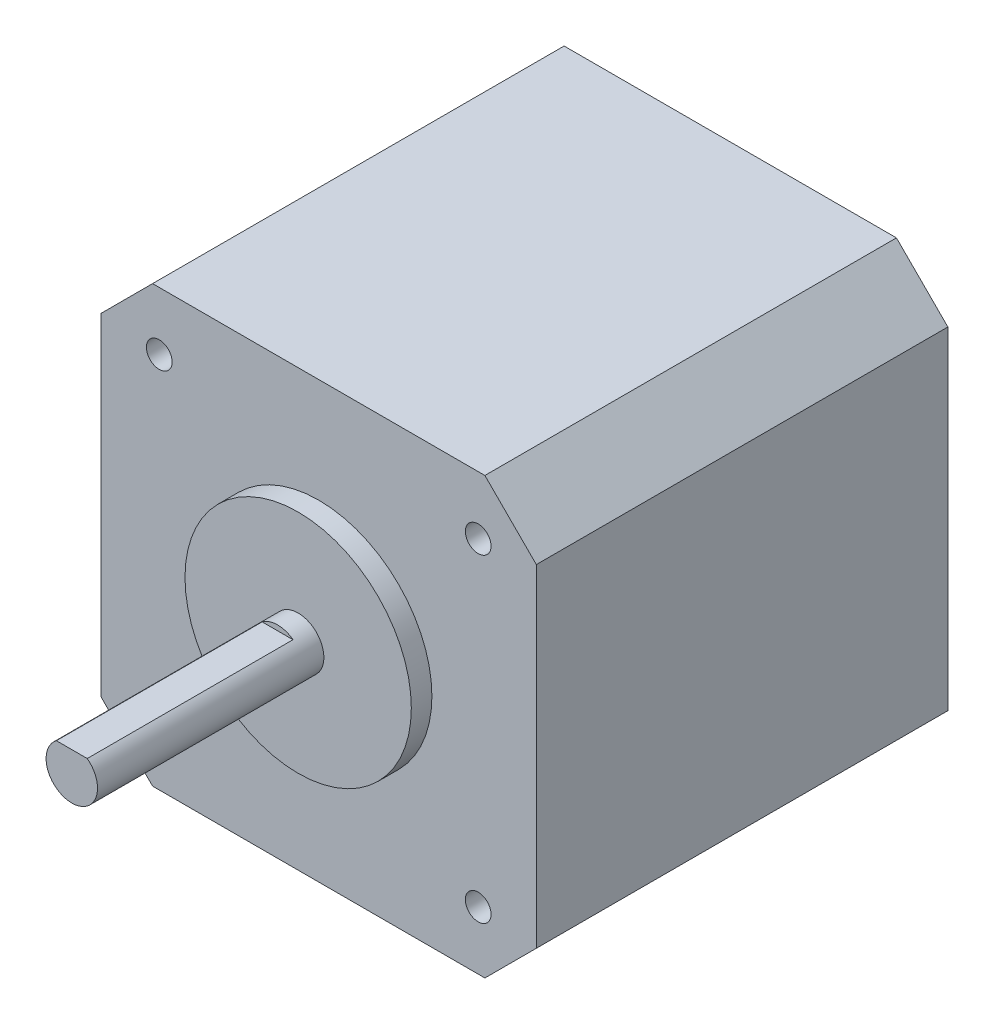
ISO-10303-21;
HEADER;
FILE_DESCRIPTION(('STEP AP214'),'2;1');
FILE_NAME('part.step','',(''),(''),'','','');
FILE_SCHEMA(('AUTOMOTIVE_DESIGN { 1 0 10303 214 1 1 1 1 }'));
ENDSEC;
DATA;
#1=APPLICATION_CONTEXT('core data for automotive mechanical design processes');
#2=APPLICATION_PROTOCOL_DEFINITION('international standard','automotive_design',2000,#1);
#3=PRODUCT_CONTEXT('',#1,'mechanical');
#4=PRODUCT('Part','Part','',(#3));
#5=PRODUCT_RELATED_PRODUCT_CATEGORY('part','',(#4));
#6=PRODUCT_DEFINITION_FORMATION('','',#4);
#7=PRODUCT_DEFINITION_CONTEXT('part definition',#1,'design');
#8=PRODUCT_DEFINITION('design','',#6,#7);
#9=PRODUCT_DEFINITION_SHAPE('','',#8);
#10=(LENGTH_UNIT() NAMED_UNIT(*) SI_UNIT(.MILLI.,.METRE.));
#11=(NAMED_UNIT(*) PLANE_ANGLE_UNIT() SI_UNIT($,.RADIAN.));
#12=(NAMED_UNIT(*) SI_UNIT($,.STERADIAN.) SOLID_ANGLE_UNIT());
#13=UNCERTAINTY_MEASURE_WITH_UNIT(LENGTH_MEASURE(1.E-05),#10,'distance_accuracy_value','');
#14=(GEOMETRIC_REPRESENTATION_CONTEXT(3) GLOBAL_UNCERTAINTY_ASSIGNED_CONTEXT((#13)) GLOBAL_UNIT_ASSIGNED_CONTEXT((#10,
#11,#12)) REPRESENTATION_CONTEXT('',''));
#15=CARTESIAN_POINT('',(0.,0.,0.));
#16=DIRECTION('',(0.,0.,1.));
#17=DIRECTION('',(1.,0.,0.));
#18=AXIS2_PLACEMENT_3D('',#15,#16,#17);
#19=CARTESIAN_POINT('',(-20.7678035150955,14.3726232792642,40.));
#20=DIRECTION('',(1.,0.,0.));
#21=DIRECTION('',(0.,0.,-1.));
#22=AXIS2_PLACEMENT_3D('',#19,#20,#21);
#23=PLANE('',#22);
#24=DIRECTION('',(0.,-1.,0.));
#25=VECTOR('',#24,1.);
#26=CARTESIAN_POINT('',(-20.7678035150955,14.3726232792642,0.));
#27=LINE('',#26,#25);
#28=CARTESIAN_POINT('',(-20.7678035150955,9.37262327926421,0.));
#29=VERTEX_POINT('',#28);
#30=CARTESIAN_POINT('',(-20.7678035150955,-22.9273767207358,0.));
#31=VERTEX_POINT('',#30);
#32=EDGE_CURVE('E178',#29,#31,#27,.T.);
#33=ORIENTED_EDGE('',*,*,#32,.T.);
#34=DIRECTION('',(0.,0.,1.));
#35=VECTOR('',#34,1.);
#36=CARTESIAN_POINT('',(-20.7678035150955,-22.9273767207358,40.));
#37=LINE('',#36,#35);
#38=CARTESIAN_POINT('',(-20.7678035150955,-22.9273767207358,40.));
#39=VERTEX_POINT('',#38);
#40=EDGE_CURVE('E11',#31,#39,#37,.T.);
#41=ORIENTED_EDGE('',*,*,#40,.T.);
#42=DIRECTION('',(0.,-1.,0.));
#43=VECTOR('',#42,1.);
#44=CARTESIAN_POINT('',(-20.7678035150955,14.3726232792642,40.));
#45=LINE('',#44,#43);
#46=CARTESIAN_POINT('',(-20.7678035150955,9.37262327926421,40.));
#47=VERTEX_POINT('',#46);
#48=EDGE_CURVE('E182',#47,#39,#45,.T.);
#49=ORIENTED_EDGE('',*,*,#48,.F.);
#50=DIRECTION('',(0.,0.,-1.));
#51=VECTOR('',#50,1.);
#52=CARTESIAN_POINT('',(-20.7678035150955,9.37262327926421,40.));
#53=LINE('',#52,#51);
#54=EDGE_CURVE('E45',#47,#29,#53,.T.);
#55=ORIENTED_EDGE('',*,*,#54,.T.);
#56=EDGE_LOOP('',(#33,#41,#49,#55));
#57=FACE_BOUND('',#56,.T.);
#58=ADVANCED_FACE('F37',(#57),#23,.F.);
#59=CARTESIAN_POINT('',(-20.7678035150955,-27.9273767207358,40.));
#60=DIRECTION('',(0.,1.,0.));
#61=DIRECTION('',(0.,0.,1.));
#62=AXIS2_PLACEMENT_3D('',#59,#60,#61);
#63=PLANE('',#62);
#64=DIRECTION('',(1.,0.,0.));
#65=VECTOR('',#64,1.);
#66=CARTESIAN_POINT('',(-20.7678035150955,-27.9273767207358,0.));
#67=LINE('',#66,#65);
#68=CARTESIAN_POINT('',(-15.7678035150955,-27.9273767207358,0.));
#69=VERTEX_POINT('',#68);
#70=CARTESIAN_POINT('',(16.5321964849045,-27.9273767207358,0.));
#71=VERTEX_POINT('',#70);
#72=EDGE_CURVE('E194',#69,#71,#67,.T.);
#73=ORIENTED_EDGE('',*,*,#72,.T.);
#74=DIRECTION('',(0.,0.,1.));
#75=VECTOR('',#74,1.);
#76=CARTESIAN_POINT('',(16.5321964849045,-27.9273767207358,40.));
#77=LINE('',#76,#75);
#78=CARTESIAN_POINT('',(16.5321964849045,-27.9273767207358,40.));
#79=VERTEX_POINT('',#78);
#80=EDGE_CURVE('E52',#71,#79,#77,.T.);
#81=ORIENTED_EDGE('',*,*,#80,.T.);
#82=DIRECTION('',(1.,0.,0.));
#83=VECTOR('',#82,1.);
#84=CARTESIAN_POINT('',(-20.7678035150955,-27.9273767207358,40.));
#85=LINE('',#84,#83);
#86=CARTESIAN_POINT('',(-15.7678035150955,-27.9273767207358,40.));
#87=VERTEX_POINT('',#86);
#88=EDGE_CURVE('E184',#87,#79,#85,.T.);
#89=ORIENTED_EDGE('',*,*,#88,.F.);
#90=DIRECTION('',(0.,0.,-1.));
#91=VECTOR('',#90,1.);
#92=CARTESIAN_POINT('',(-15.7678035150955,-27.9273767207358,40.));
#93=LINE('',#92,#91);
#94=EDGE_CURVE('E229',#87,#69,#93,.T.);
#95=ORIENTED_EDGE('',*,*,#94,.T.);
#96=EDGE_LOOP('',(#73,#81,#89,#95));
#97=FACE_BOUND('',#96,.T.);
#98=ADVANCED_FACE('F247',(#97),#63,.F.);
#99=CARTESIAN_POINT('',(21.5321964849045,14.3726232792642,40.));
#100=DIRECTION('',(-1.,0.,0.));
#101=DIRECTION('',(0.,-1.,0.));
#102=AXIS2_PLACEMENT_3D('',#99,#100,#101);
#103=PLANE('',#102);
#104=DIRECTION('',(0.,1.,0.));
#105=VECTOR('',#104,1.);
#106=CARTESIAN_POINT('',(21.5321964849045,14.3726232792642,0.));
#107=LINE('',#106,#105);
#108=CARTESIAN_POINT('',(21.5321964849045,-22.9273767207358,0.));
#109=VERTEX_POINT('',#108);
#110=CARTESIAN_POINT('',(21.5321964849045,9.37262327926419,0.));
#111=VERTEX_POINT('',#110);
#112=EDGE_CURVE('E196',#109,#111,#107,.T.);
#113=ORIENTED_EDGE('',*,*,#112,.T.);
#114=DIRECTION('',(0.,0.,1.));
#115=VECTOR('',#114,1.);
#116=CARTESIAN_POINT('',(21.5321964849045,9.37262327926419,40.));
#117=LINE('',#116,#115);
#118=CARTESIAN_POINT('',(21.5321964849045,9.37262327926419,40.));
#119=VERTEX_POINT('',#118);
#120=EDGE_CURVE('E220',#111,#119,#117,.T.);
#121=ORIENTED_EDGE('',*,*,#120,.T.);
#122=DIRECTION('',(0.,1.,0.));
#123=VECTOR('',#122,1.);
#124=CARTESIAN_POINT('',(21.5321964849045,14.3726232792642,40.));
#125=LINE('',#124,#123);
#126=CARTESIAN_POINT('',(21.5321964849045,-22.9273767207358,40.));
#127=VERTEX_POINT('',#126);
#128=EDGE_CURVE('E187',#127,#119,#125,.T.);
#129=ORIENTED_EDGE('',*,*,#128,.F.);
#130=DIRECTION('',(0.,0.,-1.));
#131=VECTOR('',#130,1.);
#132=CARTESIAN_POINT('',(21.5321964849045,-22.9273767207358,40.));
#133=LINE('',#132,#131);
#134=EDGE_CURVE('E217',#127,#109,#133,.T.);
#135=ORIENTED_EDGE('',*,*,#134,.T.);
#136=EDGE_LOOP('',(#113,#121,#129,#135));
#137=FACE_BOUND('',#136,.T.);
#138=ADVANCED_FACE('F256',(#137),#103,.F.);
#139=CARTESIAN_POINT('',(-20.7678035150955,14.3726232792642,40.));
#140=DIRECTION('',(0.,-1.,0.));
#141=DIRECTION('',(0.,0.,-1.));
#142=AXIS2_PLACEMENT_3D('',#139,#140,#141);
#143=PLANE('',#142);
#144=DIRECTION('',(-1.,0.,0.));
#145=VECTOR('',#144,1.);
#146=CARTESIAN_POINT('',(-20.7678035150955,14.3726232792642,40.));
#147=LINE('',#146,#145);
#148=CARTESIAN_POINT('',(16.5321964849045,14.3726232792642,40.));
#149=VERTEX_POINT('',#148);
#150=CARTESIAN_POINT('',(-15.7678035150955,14.3726232792642,40.));
#151=VERTEX_POINT('',#150);
#152=EDGE_CURVE('E181',#149,#151,#147,.T.);
#153=ORIENTED_EDGE('',*,*,#152,.F.);
#154=DIRECTION('',(0.,0.,-1.));
#155=VECTOR('',#154,1.);
#156=CARTESIAN_POINT('',(16.5321964849045,14.3726232792642,40.));
#157=LINE('',#156,#155);
#158=CARTESIAN_POINT('',(16.5321964849045,14.3726232792642,0.));
#159=VERTEX_POINT('',#158);
#160=EDGE_CURVE('E206',#149,#159,#157,.T.);
#161=ORIENTED_EDGE('',*,*,#160,.T.);
#162=DIRECTION('',(-1.,0.,0.));
#163=VECTOR('',#162,1.);
#164=CARTESIAN_POINT('',(-20.7678035150955,14.3726232792642,0.));
#165=LINE('',#164,#163);
#166=CARTESIAN_POINT('',(-15.7678035150955,14.3726232792642,0.));
#167=VERTEX_POINT('',#166);
#168=EDGE_CURVE('E185',#159,#167,#165,.T.);
#169=ORIENTED_EDGE('',*,*,#168,.T.);
#170=DIRECTION('',(0.,0.,1.));
#171=VECTOR('',#170,1.);
#172=CARTESIAN_POINT('',(-15.7678035150955,14.3726232792642,40.));
#173=LINE('',#172,#171);
#174=EDGE_CURVE('E204',#167,#151,#173,.T.);
#175=ORIENTED_EDGE('',*,*,#174,.T.);
#176=EDGE_LOOP('',(#153,#161,#169,#175));
#177=FACE_BOUND('',#176,.T.);
#178=ADVANCED_FACE('F264',(#177),#143,.F.);
#179=CARTESIAN_POINT('',(0.,0.,40.));
#180=DIRECTION('',(0.,0.,1.));
#181=DIRECTION('',(1.,0.,0.));
#182=AXIS2_PLACEMENT_3D('',#179,#180,#181);
#183=PLANE('',#182);
#184=CARTESIAN_POINT('',(-15.1178035150955,8.7226232792642,40.));
#185=DIRECTION('',(0.,0.,1.));
#186=DIRECTION('',(1.,0.,0.));
#187=AXIS2_PLACEMENT_3D('',#184,#185,#186);
#188=CIRCLE('',#187,1.24999999999999);
#189=CARTESIAN_POINT('',(-13.8678035150955,8.7226232792642,40.));
#190=VERTEX_POINT('',#189);
#191=EDGE_CURVE('E136',#190,#190,#188,.T.);
#192=ORIENTED_EDGE('',*,*,#191,.F.);
#193=EDGE_LOOP('',(#192));
#194=FACE_BOUND('',#193,.T.);
#195=CARTESIAN_POINT('',(15.8821964849045,8.7226232792642,40.));
#196=DIRECTION('',(0.,0.,1.));
#197=DIRECTION('',(1.,0.,0.));
#198=AXIS2_PLACEMENT_3D('',#195,#196,#197);
#199=CIRCLE('',#198,1.24999999999999);
#200=CARTESIAN_POINT('',(17.1321964849045,8.7226232792642,40.));
#201=VERTEX_POINT('',#200);
#202=EDGE_CURVE('E135',#201,#201,#199,.T.);
#203=ORIENTED_EDGE('',*,*,#202,.F.);
#204=EDGE_LOOP('',(#203));
#205=FACE_BOUND('',#204,.T.);
#206=CARTESIAN_POINT('',(-15.1178035150955,-22.2773767207358,40.));
#207=DIRECTION('',(0.,0.,1.));
#208=DIRECTION('',(1.,0.,0.));
#209=AXIS2_PLACEMENT_3D('',#206,#207,#208);
#210=CIRCLE('',#209,1.24999999999999);
#211=CARTESIAN_POINT('',(-13.8678035150955,-22.2773767207358,40.));
#212=VERTEX_POINT('',#211);
#213=EDGE_CURVE('E146',#212,#212,#210,.T.);
#214=ORIENTED_EDGE('',*,*,#213,.F.);
#215=EDGE_LOOP('',(#214));
#216=FACE_BOUND('',#215,.T.);
#217=CARTESIAN_POINT('',(15.8821964849045,-22.2773767207358,40.));
#218=DIRECTION('',(0.,0.,1.));
#219=DIRECTION('',(1.,0.,0.));
#220=AXIS2_PLACEMENT_3D('',#217,#218,#219);
#221=CIRCLE('',#220,1.24999999999999);
#222=CARTESIAN_POINT('',(17.1321964849045,-22.2773767207358,40.));
#223=VERTEX_POINT('',#222);
#224=EDGE_CURVE('E152',#223,#223,#221,.T.);
#225=ORIENTED_EDGE('',*,*,#224,.F.);
#226=EDGE_LOOP('',(#225));
#227=FACE_BOUND('',#226,.T.);
#228=CARTESIAN_POINT('',(0.382196484904496,-6.7773767207358,40.));
#229=DIRECTION('',(0.,0.,1.));
#230=DIRECTION('',(1.,0.,0.));
#231=AXIS2_PLACEMENT_3D('',#228,#229,#230);
#232=CIRCLE('',#231,11.);
#233=CARTESIAN_POINT('',(11.3821964849045,-6.7773767207358,40.));
#234=VERTEX_POINT('',#233);
#235=EDGE_CURVE('E175',#234,#234,#232,.T.);
#236=ORIENTED_EDGE('',*,*,#235,.F.);
#237=EDGE_LOOP('',(#236));
#238=FACE_BOUND('',#237,.T.);
#239=ORIENTED_EDGE('',*,*,#128,.T.);
#240=DIRECTION('',(0.707106781186546,-0.707106781186549,0.));
#241=VECTOR('',#240,1.);
#242=CARTESIAN_POINT('',(15.4524098820844,15.4524098820843,40.));
#243=LINE('',#242,#241);
#244=EDGE_CURVE('E227',#119,#149,#243,.F.);
#245=ORIENTED_EDGE('',*,*,#244,.T.);
#246=ORIENTED_EDGE('',*,*,#152,.T.);
#247=DIRECTION('',(0.707106781186549,0.707106781186546,0.));
#248=VECTOR('',#247,1.);
#249=CARTESIAN_POINT('',(-15.0702133971798,15.0702133971799,40.));
#250=LINE('',#249,#248);
#251=EDGE_CURVE('E222',#151,#47,#250,.F.);
#252=ORIENTED_EDGE('',*,*,#251,.T.);
#253=ORIENTED_EDGE('',*,*,#48,.T.);
#254=DIRECTION('',(-0.707106781186546,0.707106781186549,0.));
#255=VECTOR('',#254,1.);
#256=CARTESIAN_POINT('',(-21.8475901179157,-21.8475901179156,40.));
#257=LINE('',#256,#255);
#258=EDGE_CURVE('E59',#39,#87,#257,.F.);
#259=ORIENTED_EDGE('',*,*,#258,.T.);
#260=ORIENTED_EDGE('',*,*,#88,.T.);
#261=DIRECTION('',(-0.707106781186549,-0.707106781186546,0.));
#262=VECTOR('',#261,1.);
#263=CARTESIAN_POINT('',(22.2297866028201,-22.2297866028202,40.));
#264=LINE('',#263,#262);
#265=EDGE_CURVE('E225',#79,#127,#264,.F.);
#266=ORIENTED_EDGE('',*,*,#265,.T.);
#267=EDGE_LOOP('',(#239,#245,#246,#252,#253,#259,#260,#266));
#268=FACE_BOUND('',#267,.T.);
#269=ADVANCED_FACE('F249',(#194,#205,#216,#227,#238,#268),#183,.T.);
#270=CARTESIAN_POINT('',(0.,0.,0.));
#271=DIRECTION('',(0.,0.,1.));
#272=DIRECTION('',(1.,0.,0.));
#273=AXIS2_PLACEMENT_3D('',#270,#271,#272);
#274=PLANE('',#273);
#275=ORIENTED_EDGE('',*,*,#168,.F.);
#276=DIRECTION('',(-0.707106781186546,0.707106781186549,0.));
#277=VECTOR('',#276,1.);
#278=CARTESIAN_POINT('',(16.5321964849045,14.3726232792642,0.));
#279=LINE('',#278,#277);
#280=EDGE_CURVE('E215',#159,#111,#279,.F.);
#281=ORIENTED_EDGE('',*,*,#280,.T.);
#282=ORIENTED_EDGE('',*,*,#112,.F.);
#283=DIRECTION('',(0.707106781186549,0.707106781186546,0.));
#284=VECTOR('',#283,1.);
#285=CARTESIAN_POINT('',(21.5321964849045,-22.9273767207358,0.));
#286=LINE('',#285,#284);
#287=EDGE_CURVE('E213',#109,#71,#286,.F.);
#288=ORIENTED_EDGE('',*,*,#287,.T.);
#289=ORIENTED_EDGE('',*,*,#72,.F.);
#290=DIRECTION('',(0.707106781186546,-0.707106781186549,0.));
#291=VECTOR('',#290,1.);
#292=CARTESIAN_POINT('',(-15.7678035150955,-27.9273767207358,0.));
#293=LINE('',#292,#291);
#294=EDGE_CURVE('E211',#69,#31,#293,.F.);
#295=ORIENTED_EDGE('',*,*,#294,.T.);
#296=ORIENTED_EDGE('',*,*,#32,.F.);
#297=DIRECTION('',(-0.707106781186549,-0.707106781186546,0.));
#298=VECTOR('',#297,1.);
#299=CARTESIAN_POINT('',(-20.7678035150955,9.37262327926421,0.));
#300=LINE('',#299,#298);
#301=EDGE_CURVE('E209',#29,#167,#300,.F.);
#302=ORIENTED_EDGE('',*,*,#301,.T.);
#303=EDGE_LOOP('',(#275,#281,#282,#288,#289,#295,#296,#302));
#304=FACE_BOUND('',#303,.T.);
#305=ADVANCED_FACE('F242',(#304),#274,.F.);
#306=CARTESIAN_POINT('',(0.382196484904496,-6.7773767207358,42.));
#307=DIRECTION('',(0.,0.,-1.));
#308=DIRECTION('',(-1.,0.,0.));
#309=AXIS2_PLACEMENT_3D('',#306,#307,#308);
#310=CYLINDRICAL_SURFACE('',#309,11.);
#311=CARTESIAN_POINT('',(0.382196484904496,-6.7773767207358,42.));
#312=DIRECTION('',(0.,0.,1.));
#313=DIRECTION('',(1.,0.,0.));
#314=AXIS2_PLACEMENT_3D('',#311,#312,#313);
#315=CIRCLE('',#314,11.);
#316=CARTESIAN_POINT('',(11.3821964849045,-6.7773767207358,42.));
#317=VERTEX_POINT('',#316);
#318=EDGE_CURVE('E170',#317,#317,#315,.T.);
#319=ORIENTED_EDGE('',*,*,#318,.F.);
#320=EDGE_LOOP('',(#319));
#321=FACE_BOUND('',#320,.T.);
#322=ORIENTED_EDGE('',*,*,#235,.T.);
#323=EDGE_LOOP('',(#322));
#324=FACE_BOUND('',#323,.T.);
#325=ADVANCED_FACE('F416',(#321,#324),#310,.T.);
#326=CARTESIAN_POINT('',(0.382196484904496,-6.7773767207358,42.));
#327=DIRECTION('',(0.,0.,1.));
#328=DIRECTION('',(1.,0.,0.));
#329=AXIS2_PLACEMENT_3D('',#326,#327,#328);
#330=PLANE('',#329);
#331=CARTESIAN_POINT('',(0.382196484904495,-6.7773767207358,42.));
#332=DIRECTION('',(0.,0.,1.));
#333=DIRECTION('',(1.,0.,0.));
#334=AXIS2_PLACEMENT_3D('',#331,#332,#333);
#335=CIRCLE('',#334,2.5);
#336=CARTESIAN_POINT('',(2.8821964849045,-6.7773767207358,42.));
#337=VERTEX_POINT('',#336);
#338=EDGE_CURVE('E171',#337,#337,#335,.T.);
#339=ORIENTED_EDGE('',*,*,#338,.F.);
#340=EDGE_LOOP('',(#339));
#341=FACE_BOUND('',#340,.T.);
#342=ORIENTED_EDGE('',*,*,#318,.T.);
#343=EDGE_LOOP('',(#342));
#344=FACE_BOUND('',#343,.T.);
#345=ADVANCED_FACE('F407',(#341,#344),#330,.T.);
#346=CARTESIAN_POINT('',(0.382196484904495,-6.7773767207358,64.));
#347=DIRECTION('',(0.,0.,-1.));
#348=DIRECTION('',(-1.,0.,0.));
#349=AXIS2_PLACEMENT_3D('',#346,#347,#348);
#350=CYLINDRICAL_SURFACE('',#349,2.5);
#351=CARTESIAN_POINT('',(0.382196484904495,-6.7773767207358,64.));
#352=DIRECTION('',(0.,0.,1.));
#353=DIRECTION('',(1.,0.,0.));
#354=AXIS2_PLACEMENT_3D('',#351,#352,#353);
#355=CIRCLE('',#354,2.5);
#356=CARTESIAN_POINT('',(-1.11780351509551,-4.7773767207358,64.));
#357=VERTEX_POINT('',#356);
#358=CARTESIAN_POINT('',(1.8821964849045,-4.7773767207358,64.));
#359=VERTEX_POINT('',#358);
#360=EDGE_CURVE('E167',#357,#359,#355,.T.);
#361=ORIENTED_EDGE('',*,*,#360,.F.);
#362=DIRECTION('',(0.,0.,-1.));
#363=VECTOR('',#362,1.);
#364=CARTESIAN_POINT('',(-1.11780351509551,-4.7773767207358,64.));
#365=LINE('',#364,#363);
#366=CARTESIAN_POINT('',(-1.11780351509551,-4.7773767207358,44.));
#367=VERTEX_POINT('',#366);
#368=EDGE_CURVE('E164',#357,#367,#365,.T.);
#369=ORIENTED_EDGE('',*,*,#368,.T.);
#370=CARTESIAN_POINT('',(0.382196484904495,-6.7773767207358,44.));
#371=DIRECTION('',(0.,0.,1.));
#372=DIRECTION('',(1.,0.,0.));
#373=AXIS2_PLACEMENT_3D('',#370,#371,#372);
#374=CIRCLE('',#373,2.5);
#375=CARTESIAN_POINT('',(1.88219648490449,-4.7773767207358,44.));
#376=VERTEX_POINT('',#375);
#377=EDGE_CURVE('E202',#376,#367,#374,.T.);
#378=ORIENTED_EDGE('',*,*,#377,.F.);
#379=DIRECTION('',(0.,0.,-1.));
#380=VECTOR('',#379,1.);
#381=CARTESIAN_POINT('',(1.8821964849045,-4.7773767207358,64.));
#382=LINE('',#381,#380);
#383=EDGE_CURVE('E161',#376,#359,#382,.F.);
#384=ORIENTED_EDGE('',*,*,#383,.T.);
#385=EDGE_LOOP('',(#361,#369,#378,#384));
#386=FACE_BOUND('',#385,.T.);
#387=ORIENTED_EDGE('',*,*,#338,.T.);
#388=EDGE_LOOP('',(#387));
#389=FACE_BOUND('',#388,.T.);
#390=ADVANCED_FACE('F398',(#386,#389),#350,.T.);
#391=CARTESIAN_POINT('',(0.382196484904495,-6.7773767207358,64.));
#392=DIRECTION('',(0.,0.,1.));
#393=DIRECTION('',(1.,0.,0.));
#394=AXIS2_PLACEMENT_3D('',#391,#392,#393);
#395=PLANE('',#394);
#396=DIRECTION('',(1.,0.,0.));
#397=VECTOR('',#396,1.);
#398=CARTESIAN_POINT('',(0.382196484904494,-4.7773767207358,64.));
#399=LINE('',#398,#397);
#400=EDGE_CURVE('E174',#357,#359,#399,.T.);
#401=ORIENTED_EDGE('',*,*,#400,.F.);
#402=ORIENTED_EDGE('',*,*,#360,.T.);
#403=EDGE_LOOP('',(#401,#402));
#404=FACE_BOUND('',#403,.T.);
#405=ADVANCED_FACE('F389',(#404),#395,.T.);
#406=CARTESIAN_POINT('',(0.,0.,44.));
#407=DIRECTION('',(0.,0.,1.));
#408=DIRECTION('',(1.,0.,0.));
#409=AXIS2_PLACEMENT_3D('',#406,#407,#408);
#410=PLANE('',#409);
#411=DIRECTION('',(1.,0.,0.));
#412=VECTOR('',#411,1.);
#413=CARTESIAN_POINT('',(-2.11780351509551,-4.7773767207358,44.));
#414=LINE('',#413,#412);
#415=EDGE_CURVE('E158',#367,#376,#414,.T.);
#416=ORIENTED_EDGE('',*,*,#415,.T.);
#417=ORIENTED_EDGE('',*,*,#377,.T.);
#418=EDGE_LOOP('',(#416,#417));
#419=FACE_BOUND('',#418,.T.);
#420=ADVANCED_FACE('F380',(#419),#410,.T.);
#421=CARTESIAN_POINT('',(-2.11780351509551,-4.7773767207358,44.));
#422=DIRECTION('',(0.,-1.,0.));
#423=DIRECTION('',(1.,0.,0.));
#424=AXIS2_PLACEMENT_3D('',#421,#422,#423);
#425=PLANE('',#424);
#426=ORIENTED_EDGE('',*,*,#400,.T.);
#427=ORIENTED_EDGE('',*,*,#383,.F.);
#428=ORIENTED_EDGE('',*,*,#415,.F.);
#429=ORIENTED_EDGE('',*,*,#368,.F.);
#430=EDGE_LOOP('',(#426,#427,#428,#429));
#431=FACE_BOUND('',#430,.T.);
#432=ADVANCED_FACE('F371',(#431),#425,.F.);
#433=CARTESIAN_POINT('',(15.8821964849045,-22.2773767207358,31.5));
#434=DIRECTION('',(0.,0.,1.));
#435=DIRECTION('',(1.,0.,0.));
#436=AXIS2_PLACEMENT_3D('',#433,#434,#435);
#437=CONICAL_SURFACE('',#436,1.25,1.02974425867665);
#438=CARTESIAN_POINT('',(15.8821964849045,-22.2773767207358,30.7489242262155));
#439=VERTEX_POINT('',#438);
#440=VERTEX_LOOP('',#439);
#441=FACE_BOUND('',#440,.T.);
#442=CARTESIAN_POINT('',(15.8821964849045,-22.2773767207358,31.5));
#443=DIRECTION('',(0.,0.,1.));
#444=DIRECTION('',(1.,0.,0.));
#445=AXIS2_PLACEMENT_3D('',#442,#443,#444);
#446=CIRCLE('',#445,1.25);
#447=CARTESIAN_POINT('',(17.1321964849045,-22.2773767207358,31.5));
#448=VERTEX_POINT('',#447);
#449=EDGE_CURVE('E155',#448,#448,#446,.T.);
#450=ORIENTED_EDGE('',*,*,#449,.T.);
#451=EDGE_LOOP('',(#450));
#452=FACE_BOUND('',#451,.T.);
#453=ADVANCED_FACE('F361',(#441,#452),#437,.F.);
#454=CARTESIAN_POINT('',(15.8821964849045,-22.2773767207358,40.));
#455=DIRECTION('',(0.,0.,1.));
#456=DIRECTION('',(1.,0.,0.));
#457=AXIS2_PLACEMENT_3D('',#454,#455,#456);
#458=CYLINDRICAL_SURFACE('',#457,1.24999999999999);
#459=ORIENTED_EDGE('',*,*,#449,.F.);
#460=EDGE_LOOP('',(#459));
#461=FACE_BOUND('',#460,.T.);
#462=ORIENTED_EDGE('',*,*,#224,.T.);
#463=EDGE_LOOP('',(#462));
#464=FACE_BOUND('',#463,.T.);
#465=ADVANCED_FACE('F352',(#461,#464),#458,.F.);
#466=CARTESIAN_POINT('',(-15.1178035150955,-22.2773767207358,31.5));
#467=DIRECTION('',(0.,0.,1.));
#468=DIRECTION('',(1.,0.,0.));
#469=AXIS2_PLACEMENT_3D('',#466,#467,#468);
#470=CONICAL_SURFACE('',#469,1.25,1.02974425867665);
#471=CARTESIAN_POINT('',(-15.1178035150955,-22.2773767207358,30.7489242262155));
#472=VERTEX_POINT('',#471);
#473=VERTEX_LOOP('',#472);
#474=FACE_BOUND('',#473,.T.);
#475=CARTESIAN_POINT('',(-15.1178035150955,-22.2773767207358,31.5));
#476=DIRECTION('',(0.,0.,1.));
#477=DIRECTION('',(1.,0.,0.));
#478=AXIS2_PLACEMENT_3D('',#475,#476,#477);
#479=CIRCLE('',#478,1.25);
#480=CARTESIAN_POINT('',(-13.8678035150955,-22.2773767207358,31.5));
#481=VERTEX_POINT('',#480);
#482=EDGE_CURVE('E149',#481,#481,#479,.T.);
#483=ORIENTED_EDGE('',*,*,#482,.T.);
#484=EDGE_LOOP('',(#483));
#485=FACE_BOUND('',#484,.T.);
#486=ADVANCED_FACE('F342',(#474,#485),#470,.F.);
#487=CARTESIAN_POINT('',(-15.1178035150955,-22.2773767207358,40.));
#488=DIRECTION('',(0.,0.,1.));
#489=DIRECTION('',(1.,0.,0.));
#490=AXIS2_PLACEMENT_3D('',#487,#488,#489);
#491=CYLINDRICAL_SURFACE('',#490,1.24999999999999);
#492=ORIENTED_EDGE('',*,*,#482,.F.);
#493=EDGE_LOOP('',(#492));
#494=FACE_BOUND('',#493,.T.);
#495=ORIENTED_EDGE('',*,*,#213,.T.);
#496=EDGE_LOOP('',(#495));
#497=FACE_BOUND('',#496,.T.);
#498=ADVANCED_FACE('F333',(#494,#497),#491,.F.);
#499=CARTESIAN_POINT('',(15.8821964849045,8.7226232792642,31.5));
#500=DIRECTION('',(0.,0.,1.));
#501=DIRECTION('',(1.,0.,0.));
#502=AXIS2_PLACEMENT_3D('',#499,#500,#501);
#503=CONICAL_SURFACE('',#502,1.25,1.02974425867665);
#504=CARTESIAN_POINT('',(15.8821964849045,8.7226232792642,30.7489242262155));
#505=VERTEX_POINT('',#504);
#506=VERTEX_LOOP('',#505);
#507=FACE_BOUND('',#506,.T.);
#508=CARTESIAN_POINT('',(15.8821964849045,8.7226232792642,31.5));
#509=DIRECTION('',(0.,0.,1.));
#510=DIRECTION('',(1.,0.,0.));
#511=AXIS2_PLACEMENT_3D('',#508,#509,#510);
#512=CIRCLE('',#511,1.25);
#513=CARTESIAN_POINT('',(17.1321964849045,8.7226232792642,31.5));
#514=VERTEX_POINT('',#513);
#515=EDGE_CURVE('E139',#514,#514,#512,.T.);
#516=ORIENTED_EDGE('',*,*,#515,.T.);
#517=EDGE_LOOP('',(#516));
#518=FACE_BOUND('',#517,.T.);
#519=ADVANCED_FACE('F323',(#507,#518),#503,.F.);
#520=CARTESIAN_POINT('',(15.8821964849045,8.7226232792642,40.));
#521=DIRECTION('',(0.,0.,1.));
#522=DIRECTION('',(1.,0.,0.));
#523=AXIS2_PLACEMENT_3D('',#520,#521,#522);
#524=CYLINDRICAL_SURFACE('',#523,1.24999999999999);
#525=ORIENTED_EDGE('',*,*,#515,.F.);
#526=EDGE_LOOP('',(#525));
#527=FACE_BOUND('',#526,.T.);
#528=ORIENTED_EDGE('',*,*,#202,.T.);
#529=EDGE_LOOP('',(#528));
#530=FACE_BOUND('',#529,.T.);
#531=ADVANCED_FACE('F129',(#527,#530),#524,.F.);
#532=CARTESIAN_POINT('',(-15.1178035150955,8.7226232792642,31.5));
#533=DIRECTION('',(0.,0.,1.));
#534=DIRECTION('',(1.,0.,0.));
#535=AXIS2_PLACEMENT_3D('',#532,#533,#534);
#536=CONICAL_SURFACE('',#535,1.25,1.02974425867665);
#537=CARTESIAN_POINT('',(-15.1178035150955,8.7226232792642,30.7489242262155));
#538=VERTEX_POINT('',#537);
#539=VERTEX_LOOP('',#538);
#540=FACE_BOUND('',#539,.T.);
#541=CARTESIAN_POINT('',(-15.1178035150955,8.7226232792642,31.5));
#542=DIRECTION('',(0.,0.,1.));
#543=DIRECTION('',(1.,0.,0.));
#544=AXIS2_PLACEMENT_3D('',#541,#542,#543);
#545=CIRCLE('',#544,1.25);
#546=CARTESIAN_POINT('',(-13.8678035150955,8.7226232792642,31.5));
#547=VERTEX_POINT('',#546);
#548=EDGE_CURVE('E133',#547,#547,#545,.T.);
#549=ORIENTED_EDGE('',*,*,#548,.T.);
#550=EDGE_LOOP('',(#549));
#551=FACE_BOUND('',#550,.T.);
#552=ADVANCED_FACE('F125',(#540,#551),#536,.F.);
#553=CARTESIAN_POINT('',(-15.1178035150955,8.7226232792642,40.));
#554=DIRECTION('',(0.,0.,1.));
#555=DIRECTION('',(1.,0.,0.));
#556=AXIS2_PLACEMENT_3D('',#553,#554,#555);
#557=CYLINDRICAL_SURFACE('',#556,1.24999999999999);
#558=ORIENTED_EDGE('',*,*,#548,.F.);
#559=EDGE_LOOP('',(#558));
#560=FACE_BOUND('',#559,.T.);
#561=ORIENTED_EDGE('',*,*,#191,.T.);
#562=EDGE_LOOP('',(#561));
#563=FACE_BOUND('',#562,.T.);
#564=ADVANCED_FACE('F128',(#560,#563),#557,.F.);
#565=CARTESIAN_POINT('',(16.5321964849045,14.3726232792642,40.));
#566=DIRECTION('',(-0.707106781186549,-0.707106781186546,0.));
#567=DIRECTION('',(0.,0.,-1.));
#568=AXIS2_PLACEMENT_3D('',#565,#566,#567);
#569=PLANE('',#568);
#570=ORIENTED_EDGE('',*,*,#244,.F.);
#571=ORIENTED_EDGE('',*,*,#120,.F.);
#572=ORIENTED_EDGE('',*,*,#280,.F.);
#573=ORIENTED_EDGE('',*,*,#160,.F.);
#574=EDGE_LOOP('',(#570,#571,#572,#573));
#575=FACE_BOUND('',#574,.T.);
#576=ADVANCED_FACE('F261',(#575),#569,.F.);
#577=CARTESIAN_POINT('',(21.5321964849045,-22.9273767207358,40.));
#578=DIRECTION('',(-0.707106781186546,0.707106781186549,0.));
#579=DIRECTION('',(0.,0.,-1.));
#580=AXIS2_PLACEMENT_3D('',#577,#578,#579);
#581=PLANE('',#580);
#582=ORIENTED_EDGE('',*,*,#265,.F.);
#583=ORIENTED_EDGE('',*,*,#80,.F.);
#584=ORIENTED_EDGE('',*,*,#287,.F.);
#585=ORIENTED_EDGE('',*,*,#134,.F.);
#586=EDGE_LOOP('',(#582,#583,#584,#585));
#587=FACE_BOUND('',#586,.T.);
#588=ADVANCED_FACE('F253',(#587),#581,.F.);
#589=CARTESIAN_POINT('',(-15.7678035150955,-27.9273767207358,40.));
#590=DIRECTION('',(0.707106781186549,0.707106781186546,0.));
#591=DIRECTION('',(0.,0.,-1.));
#592=AXIS2_PLACEMENT_3D('',#589,#590,#591);
#593=PLANE('',#592);
#594=ORIENTED_EDGE('',*,*,#258,.F.);
#595=ORIENTED_EDGE('',*,*,#40,.F.);
#596=ORIENTED_EDGE('',*,*,#294,.F.);
#597=ORIENTED_EDGE('',*,*,#94,.F.);
#598=EDGE_LOOP('',(#594,#595,#596,#597));
#599=FACE_BOUND('',#598,.T.);
#600=ADVANCED_FACE('F246',(#599),#593,.F.);
#601=CARTESIAN_POINT('',(-20.7678035150955,9.37262327926421,40.));
#602=DIRECTION('',(0.707106781186546,-0.707106781186549,0.));
#603=DIRECTION('',(0.,0.,-1.));
#604=AXIS2_PLACEMENT_3D('',#601,#602,#603);
#605=PLANE('',#604);
#606=ORIENTED_EDGE('',*,*,#251,.F.);
#607=ORIENTED_EDGE('',*,*,#174,.F.);
#608=ORIENTED_EDGE('',*,*,#301,.F.);
#609=ORIENTED_EDGE('',*,*,#54,.F.);
#610=EDGE_LOOP('',(#606,#607,#608,#609));
#611=FACE_BOUND('',#610,.T.);
#612=ADVANCED_FACE('F39',(#611),#605,.F.);
#613=CLOSED_SHELL('',(#58,#98,#138,#178,#269,#305,#325,#345,#390,#405,#420,#432,#453,#465,#486,
#498,#519,#531,#552,#564,#576,#588,#600,#612));
#614=MANIFOLD_SOLID_BREP('B2',#613);
#615=ADVANCED_BREP_SHAPE_REPRESENTATION('',(#18,#614),#14);
#616=SHAPE_DEFINITION_REPRESENTATION(#9,#615);
ENDSEC;
END-ISO-10303-21;
